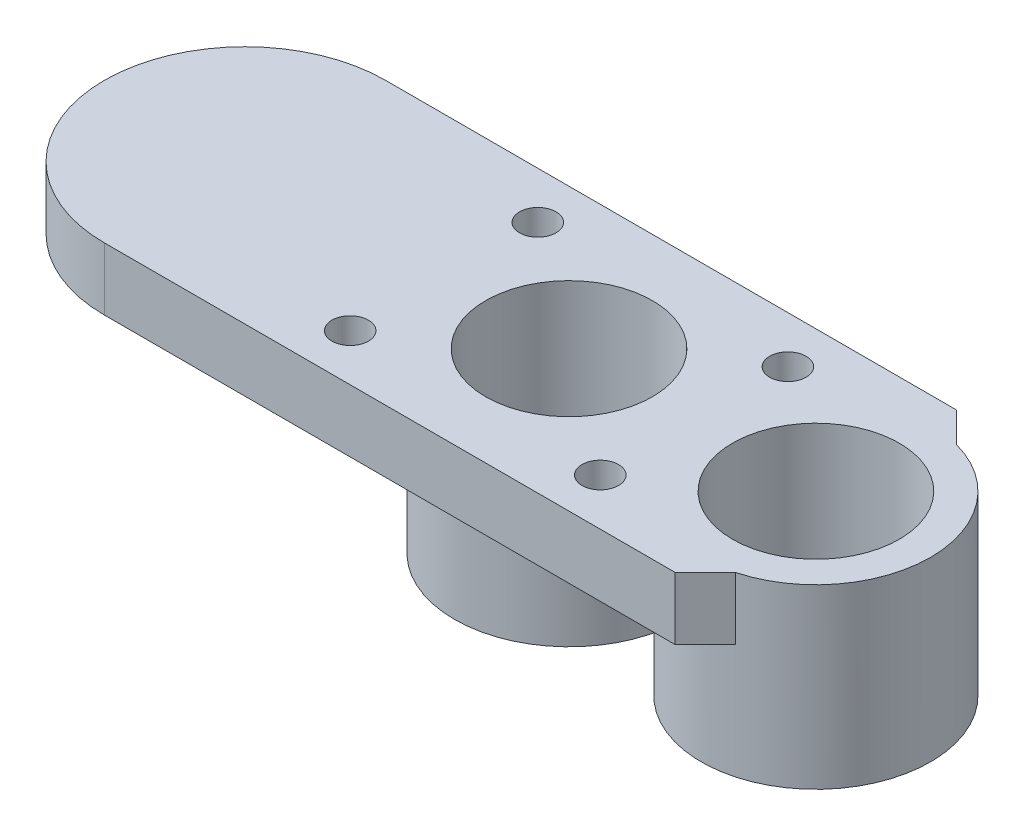
ISO-10303-21;
HEADER;
FILE_DESCRIPTION(('STEP AP214'),'2;1');
FILE_NAME('part.step','',(''),(''),'','','');
FILE_SCHEMA(('AUTOMOTIVE_DESIGN { 1 0 10303 214 1 1 1 1 }'));
ENDSEC;
DATA;
#1=APPLICATION_CONTEXT('core data for automotive mechanical design processes');
#2=APPLICATION_PROTOCOL_DEFINITION('international standard','automotive_design',2000,#1);
#3=PRODUCT_CONTEXT('',#1,'mechanical');
#4=PRODUCT('Part','Part','',(#3));
#5=PRODUCT_RELATED_PRODUCT_CATEGORY('part','',(#4));
#6=PRODUCT_DEFINITION_FORMATION('','',#4);
#7=PRODUCT_DEFINITION_CONTEXT('part definition',#1,'design');
#8=PRODUCT_DEFINITION('design','',#6,#7);
#9=PRODUCT_DEFINITION_SHAPE('','',#8);
#10=(LENGTH_UNIT() NAMED_UNIT(*) SI_UNIT(.MILLI.,.METRE.));
#11=(NAMED_UNIT(*) PLANE_ANGLE_UNIT() SI_UNIT($,.RADIAN.));
#12=(NAMED_UNIT(*) SI_UNIT($,.STERADIAN.) SOLID_ANGLE_UNIT());
#13=UNCERTAINTY_MEASURE_WITH_UNIT(LENGTH_MEASURE(1.E-05),#10,'distance_accuracy_value','');
#14=(GEOMETRIC_REPRESENTATION_CONTEXT(3) GLOBAL_UNCERTAINTY_ASSIGNED_CONTEXT((#13)) GLOBAL_UNIT_ASSIGNED_CONTEXT((#10,
#11,#12)) REPRESENTATION_CONTEXT('',''));
#15=CARTESIAN_POINT('',(0.,0.,0.));
#16=DIRECTION('',(0.,0.,1.));
#17=DIRECTION('',(1.,0.,0.));
#18=AXIS2_PLACEMENT_3D('',#15,#16,#17);
#19=CARTESIAN_POINT('',(12.,6.,-9.));
#20=DIRECTION('',(0.,-1.,0.));
#21=DIRECTION('',(0.,0.,-1.));
#22=AXIS2_PLACEMENT_3D('',#19,#20,#21);
#23=CYLINDRICAL_SURFACE('',#22,1.75);
#24=CARTESIAN_POINT('',(12.,6.,-9.));
#25=DIRECTION('',(0.,1.,0.));
#26=DIRECTION('',(0.,0.,1.));
#27=AXIS2_PLACEMENT_3D('',#24,#25,#26);
#28=CIRCLE('',#27,1.75);
#29=CARTESIAN_POINT('',(12.,6.,-7.25));
#30=VERTEX_POINT('',#29);
#31=EDGE_CURVE('E105',#30,#30,#28,.T.);
#32=ORIENTED_EDGE('',*,*,#31,.T.);
#33=EDGE_LOOP('',(#32));
#34=FACE_BOUND('',#33,.T.);
#35=CARTESIAN_POINT('',(12.,3.,-9.));
#36=DIRECTION('',(0.,-1.,0.));
#37=DIRECTION('',(0.,0.,-1.));
#38=AXIS2_PLACEMENT_3D('',#35,#36,#37);
#39=CIRCLE('',#38,1.75);
#40=CARTESIAN_POINT('',(12.,3.,-10.75));
#41=VERTEX_POINT('',#40);
#42=EDGE_CURVE('E138',#41,#41,#39,.T.);
#43=ORIENTED_EDGE('',*,*,#42,.T.);
#44=EDGE_LOOP('',(#43));
#45=FACE_BOUND('',#44,.T.);
#46=ADVANCED_FACE('F41',(#34,#45),#23,.F.);
#47=CARTESIAN_POINT('',(12.,6.,9.));
#48=DIRECTION('',(0.,-1.,0.));
#49=DIRECTION('',(0.,0.,-1.));
#50=AXIS2_PLACEMENT_3D('',#47,#48,#49);
#51=CYLINDRICAL_SURFACE('',#50,1.75);
#52=CARTESIAN_POINT('',(12.,6.,9.));
#53=DIRECTION('',(0.,1.,0.));
#54=DIRECTION('',(0.,0.,1.));
#55=AXIS2_PLACEMENT_3D('',#52,#53,#54);
#56=CIRCLE('',#55,1.75);
#57=CARTESIAN_POINT('',(12.,6.,10.75));
#58=VERTEX_POINT('',#57);
#59=EDGE_CURVE('E197',#58,#58,#56,.T.);
#60=ORIENTED_EDGE('',*,*,#59,.T.);
#61=EDGE_LOOP('',(#60));
#62=FACE_BOUND('',#61,.T.);
#63=CARTESIAN_POINT('',(12.,3.,9.));
#64=DIRECTION('',(0.,-1.,0.));
#65=DIRECTION('',(0.,0.,-1.));
#66=AXIS2_PLACEMENT_3D('',#63,#64,#65);
#67=CIRCLE('',#66,1.75);
#68=CARTESIAN_POINT('',(12.,3.,7.25));
#69=VERTEX_POINT('',#68);
#70=EDGE_CURVE('E154',#69,#69,#67,.T.);
#71=ORIENTED_EDGE('',*,*,#70,.T.);
#72=EDGE_LOOP('',(#71));
#73=FACE_BOUND('',#72,.T.);
#74=ADVANCED_FACE('F257',(#62,#73),#51,.F.);
#75=CARTESIAN_POINT('',(-12.,6.,9.));
#76=DIRECTION('',(0.,-1.,0.));
#77=DIRECTION('',(0.,0.,-1.));
#78=AXIS2_PLACEMENT_3D('',#75,#76,#77);
#79=CYLINDRICAL_SURFACE('',#78,1.75);
#80=CARTESIAN_POINT('',(-12.,6.,9.));
#81=DIRECTION('',(0.,1.,0.));
#82=DIRECTION('',(0.,0.,1.));
#83=AXIS2_PLACEMENT_3D('',#80,#81,#82);
#84=CIRCLE('',#83,1.75);
#85=CARTESIAN_POINT('',(-12.,6.,10.75));
#86=VERTEX_POINT('',#85);
#87=EDGE_CURVE('E192',#86,#86,#84,.T.);
#88=ORIENTED_EDGE('',*,*,#87,.T.);
#89=EDGE_LOOP('',(#88));
#90=FACE_BOUND('',#89,.T.);
#91=CARTESIAN_POINT('',(-12.,3.,9.));
#92=DIRECTION('',(0.,-1.,0.));
#93=DIRECTION('',(0.,0.,-1.));
#94=AXIS2_PLACEMENT_3D('',#91,#92,#93);
#95=CIRCLE('',#94,1.75);
#96=CARTESIAN_POINT('',(-12.,3.,7.25));
#97=VERTEX_POINT('',#96);
#98=EDGE_CURVE('E140',#97,#97,#95,.T.);
#99=ORIENTED_EDGE('',*,*,#98,.T.);
#100=EDGE_LOOP('',(#99));
#101=FACE_BOUND('',#100,.T.);
#102=ADVANCED_FACE('F263',(#90,#101),#79,.F.);
#103=CARTESIAN_POINT('',(-12.,6.,-9.));
#104=DIRECTION('',(0.,-1.,0.));
#105=DIRECTION('',(0.,0.,-1.));
#106=AXIS2_PLACEMENT_3D('',#103,#104,#105);
#107=CYLINDRICAL_SURFACE('',#106,1.75);
#108=CARTESIAN_POINT('',(-12.,6.,-9.));
#109=DIRECTION('',(0.,1.,0.));
#110=DIRECTION('',(0.,0.,1.));
#111=AXIS2_PLACEMENT_3D('',#108,#109,#110);
#112=CIRCLE('',#111,1.75);
#113=CARTESIAN_POINT('',(-12.,6.,-7.25));
#114=VERTEX_POINT('',#113);
#115=EDGE_CURVE('E188',#114,#114,#112,.T.);
#116=ORIENTED_EDGE('',*,*,#115,.T.);
#117=EDGE_LOOP('',(#116));
#118=FACE_BOUND('',#117,.T.);
#119=CARTESIAN_POINT('',(-12.,3.,-9.));
#120=DIRECTION('',(0.,-1.,0.));
#121=DIRECTION('',(0.,0.,-1.));
#122=AXIS2_PLACEMENT_3D('',#119,#120,#121);
#123=CIRCLE('',#122,1.75);
#124=CARTESIAN_POINT('',(-12.,3.,-10.75));
#125=VERTEX_POINT('',#124);
#126=EDGE_CURVE('E150',#125,#125,#123,.T.);
#127=ORIENTED_EDGE('',*,*,#126,.T.);
#128=EDGE_LOOP('',(#127));
#129=FACE_BOUND('',#128,.T.);
#130=ADVANCED_FACE('F271',(#118,#129),#107,.F.);
#131=CARTESIAN_POINT('',(0.,6.,13.5));
#132=DIRECTION('',(0.,0.,-1.));
#133=DIRECTION('',(-1.,0.,0.));
#134=AXIS2_PLACEMENT_3D('',#131,#132,#133);
#135=PLANE('',#134);
#136=DIRECTION('',(1.,0.,0.));
#137=VECTOR('',#136,1.);
#138=CARTESIAN_POINT('',(0.,0.,13.5));
#139=LINE('',#138,#137);
#140=CARTESIAN_POINT('',(-31.1,0.,13.5));
#141=VERTEX_POINT('',#140);
#142=CARTESIAN_POINT('',(23.69,0.,13.5));
#143=VERTEX_POINT('',#142);
#144=EDGE_CURVE('E184',#141,#143,#139,.T.);
#145=ORIENTED_EDGE('',*,*,#144,.T.);
#146=DIRECTION('',(0.,-1.,0.));
#147=VECTOR('',#146,1.);
#148=CARTESIAN_POINT('',(23.69,6.,13.5));
#149=LINE('',#148,#147);
#150=CARTESIAN_POINT('',(23.69,6.,13.5));
#151=VERTEX_POINT('',#150);
#152=EDGE_CURVE('E99',#151,#143,#149,.T.);
#153=ORIENTED_EDGE('',*,*,#152,.F.);
#154=DIRECTION('',(1.,0.,0.));
#155=VECTOR('',#154,1.);
#156=CARTESIAN_POINT('',(0.,6.,13.5));
#157=LINE('',#156,#155);
#158=CARTESIAN_POINT('',(-31.1,6.,13.5));
#159=VERTEX_POINT('',#158);
#160=EDGE_CURVE('E92',#159,#151,#157,.T.);
#161=ORIENTED_EDGE('',*,*,#160,.F.);
#162=DIRECTION('',(0.,-1.,0.));
#163=VECTOR('',#162,1.);
#164=CARTESIAN_POINT('',(-31.1,6.,13.5));
#165=LINE('',#164,#163);
#166=EDGE_CURVE('E96',#159,#141,#165,.T.);
#167=ORIENTED_EDGE('',*,*,#166,.T.);
#168=EDGE_LOOP('',(#145,#153,#161,#167));
#169=FACE_BOUND('',#168,.T.);
#170=ADVANCED_FACE('F95',(#169),#135,.F.);
#171=CARTESIAN_POINT('',(23.69,6.,0.));
#172=DIRECTION('',(0.,-1.,0.));
#173=DIRECTION('',(0.,0.,-1.));
#174=AXIS2_PLACEMENT_3D('',#171,#172,#173);
#175=CYLINDRICAL_SURFACE('',#174,11.);
#176=CARTESIAN_POINT('',(23.69,6.,0.));
#177=DIRECTION('',(0.,1.,0.));
#178=DIRECTION('',(0.,0.,1.));
#179=AXIS2_PLACEMENT_3D('',#176,#177,#178);
#180=CIRCLE('',#179,11.);
#181=CARTESIAN_POINT('',(26.575093791565,6.,10.6149062084351));
#182=VERTEX_POINT('',#181);
#183=CARTESIAN_POINT('',(26.5750937915649,6.,-10.6149062084351));
#184=VERTEX_POINT('',#183);
#185=EDGE_CURVE('E104',#182,#184,#180,.T.);
#186=ORIENTED_EDGE('',*,*,#185,.F.);
#187=DIRECTION('',(0.,-1.,0.));
#188=VECTOR('',#187,1.);
#189=CARTESIAN_POINT('',(26.575093791565,6.,10.6149062084351));
#190=LINE('',#189,#188);
#191=CARTESIAN_POINT('',(26.575093791565,0.,10.6149062084351));
#192=VERTEX_POINT('',#191);
#193=EDGE_CURVE('E225',#182,#192,#190,.T.);
#194=ORIENTED_EDGE('',*,*,#193,.T.);
#195=CARTESIAN_POINT('',(23.69,0.,0.));
#196=DIRECTION('',(0.,1.,0.));
#197=DIRECTION('',(0.,0.,1.));
#198=AXIS2_PLACEMENT_3D('',#195,#196,#197);
#199=CIRCLE('',#198,11.);
#200=CARTESIAN_POINT('',(26.5750937915649,0.,-10.6149062084351));
#201=VERTEX_POINT('',#200);
#202=EDGE_CURVE('E57',#201,#192,#199,.T.);
#203=ORIENTED_EDGE('',*,*,#202,.F.);
#204=DIRECTION('',(0.,-1.,0.));
#205=VECTOR('',#204,1.);
#206=CARTESIAN_POINT('',(26.5750937915649,6.,-10.6149062084351));
#207=LINE('',#206,#205);
#208=EDGE_CURVE('E115',#201,#184,#207,.F.);
#209=ORIENTED_EDGE('',*,*,#208,.T.);
#210=EDGE_LOOP('',(#186,#194,#203,#209));
#211=FACE_BOUND('',#210,.T.);
#212=CARTESIAN_POINT('',(23.69,-11.,0.));
#213=DIRECTION('',(0.,-1.,0.));
#214=DIRECTION('',(0.,0.,-1.));
#215=AXIS2_PLACEMENT_3D('',#212,#213,#214);
#216=CIRCLE('',#215,11.);
#217=CARTESIAN_POINT('',(23.69,-11.,-11.));
#218=VERTEX_POINT('',#217);
#219=EDGE_CURVE('E608',#218,#218,#216,.T.);
#220=ORIENTED_EDGE('',*,*,#219,.F.);
#221=EDGE_LOOP('',(#220));
#222=FACE_BOUND('',#221,.T.);
#223=ADVANCED_FACE('F241',(#211,#222),#175,.T.);
#224=CARTESIAN_POINT('',(0.,6.,-13.5));
#225=DIRECTION('',(0.,0.,-1.));
#226=DIRECTION('',(-1.,0.,0.));
#227=AXIS2_PLACEMENT_3D('',#224,#225,#226);
#228=PLANE('',#227);
#229=DIRECTION('',(1.,0.,0.));
#230=VECTOR('',#229,1.);
#231=CARTESIAN_POINT('',(0.,0.,-13.5));
#232=LINE('',#231,#230);
#233=CARTESIAN_POINT('',(-31.1,0.,-13.5));
#234=VERTEX_POINT('',#233);
#235=CARTESIAN_POINT('',(23.69,0.,-13.5));
#236=VERTEX_POINT('',#235);
#237=EDGE_CURVE('E193',#234,#236,#232,.T.);
#238=ORIENTED_EDGE('',*,*,#237,.F.);
#239=DIRECTION('',(0.,-1.,0.));
#240=VECTOR('',#239,1.);
#241=CARTESIAN_POINT('',(-31.1,6.,-13.5));
#242=LINE('',#241,#240);
#243=CARTESIAN_POINT('',(-31.1,6.,-13.5));
#244=VERTEX_POINT('',#243);
#245=EDGE_CURVE('E209',#244,#234,#242,.T.);
#246=ORIENTED_EDGE('',*,*,#245,.F.);
#247=DIRECTION('',(1.,0.,0.));
#248=VECTOR('',#247,1.);
#249=CARTESIAN_POINT('',(0.,6.,-13.5));
#250=LINE('',#249,#248);
#251=CARTESIAN_POINT('',(23.69,6.,-13.5));
#252=VERTEX_POINT('',#251);
#253=EDGE_CURVE('E121',#244,#252,#250,.T.);
#254=ORIENTED_EDGE('',*,*,#253,.T.);
#255=DIRECTION('',(0.,-1.,0.));
#256=VECTOR('',#255,1.);
#257=CARTESIAN_POINT('',(23.69,6.,-13.5));
#258=LINE('',#257,#256);
#259=EDGE_CURVE('E217',#252,#236,#258,.T.);
#260=ORIENTED_EDGE('',*,*,#259,.T.);
#261=EDGE_LOOP('',(#238,#246,#254,#260));
#262=FACE_BOUND('',#261,.T.);
#263=ADVANCED_FACE('F303',(#262),#228,.T.);
#264=CARTESIAN_POINT('',(0.,6.,0.));
#265=DIRECTION('',(0.,1.,0.));
#266=DIRECTION('',(0.,0.,1.));
#267=AXIS2_PLACEMENT_3D('',#264,#265,#266);
#268=PLANE('',#267);
#269=CARTESIAN_POINT('',(-31.1,6.,0.));
#270=DIRECTION('',(0.,1.,0.));
#271=DIRECTION('',(0.,0.,1.));
#272=AXIS2_PLACEMENT_3D('',#269,#270,#271);
#273=CIRCLE('',#272,13.5);
#274=EDGE_CURVE('E111',#244,#159,#273,.T.);
#275=ORIENTED_EDGE('',*,*,#274,.T.);
#276=ORIENTED_EDGE('',*,*,#160,.T.);
#277=DIRECTION('',(0.707106781186551,0.,-0.707106781186544));
#278=VECTOR('',#277,1.);
#279=CARTESIAN_POINT('',(26.575093791565,6.,10.6149062084351));
#280=LINE('',#279,#278);
#281=EDGE_CURVE('E231',#151,#182,#280,.T.);
#282=ORIENTED_EDGE('',*,*,#281,.T.);
#283=ORIENTED_EDGE('',*,*,#185,.T.);
#284=DIRECTION('',(-0.707106781186542,0.,-0.707106781186553));
#285=VECTOR('',#284,1.);
#286=CARTESIAN_POINT('',(23.69,6.,-13.5));
#287=LINE('',#286,#285);
#288=EDGE_CURVE('E11',#184,#252,#287,.T.);
#289=ORIENTED_EDGE('',*,*,#288,.T.);
#290=ORIENTED_EDGE('',*,*,#253,.F.);
#291=EDGE_LOOP('',(#275,#276,#282,#283,#289,#290));
#292=FACE_BOUND('',#291,.T.);
#293=CARTESIAN_POINT('',(0.,6.,0.));
#294=DIRECTION('',(0.,1.,0.));
#295=DIRECTION('',(0.,0.,1.));
#296=AXIS2_PLACEMENT_3D('',#293,#294,#295);
#297=CIRCLE('',#296,8.);
#298=CARTESIAN_POINT('',(0.,6.,8.));
#299=VERTEX_POINT('',#298);
#300=EDGE_CURVE('E128',#299,#299,#297,.T.);
#301=ORIENTED_EDGE('',*,*,#300,.F.);
#302=EDGE_LOOP('',(#301));
#303=FACE_BOUND('',#302,.T.);
#304=CARTESIAN_POINT('',(23.69,6.,0.));
#305=DIRECTION('',(0.,1.,0.));
#306=DIRECTION('',(0.,0.,1.));
#307=AXIS2_PLACEMENT_3D('',#304,#305,#306);
#308=CIRCLE('',#307,8.);
#309=CARTESIAN_POINT('',(23.69,6.,8.));
#310=VERTEX_POINT('',#309);
#311=EDGE_CURVE('E123',#310,#310,#308,.T.);
#312=ORIENTED_EDGE('',*,*,#311,.F.);
#313=EDGE_LOOP('',(#312));
#314=FACE_BOUND('',#313,.T.);
#315=ORIENTED_EDGE('',*,*,#115,.F.);
#316=EDGE_LOOP('',(#315));
#317=FACE_BOUND('',#316,.T.);
#318=ORIENTED_EDGE('',*,*,#87,.F.);
#319=EDGE_LOOP('',(#318));
#320=FACE_BOUND('',#319,.T.);
#321=ORIENTED_EDGE('',*,*,#59,.F.);
#322=EDGE_LOOP('',(#321));
#323=FACE_BOUND('',#322,.T.);
#324=ORIENTED_EDGE('',*,*,#31,.F.);
#325=EDGE_LOOP('',(#324));
#326=FACE_BOUND('',#325,.T.);
#327=ADVANCED_FACE('F118',(#292,#303,#314,#317,#320,#323,#326),#268,.T.);
#328=CARTESIAN_POINT('',(0.,0.,0.));
#329=DIRECTION('',(0.,1.,0.));
#330=DIRECTION('',(0.,0.,1.));
#331=AXIS2_PLACEMENT_3D('',#328,#329,#330);
#332=PLANE('',#331);
#333=CARTESIAN_POINT('',(0.,0.,0.));
#334=DIRECTION('',(0.,1.,0.));
#335=DIRECTION('',(0.,0.,1.));
#336=AXIS2_PLACEMENT_3D('',#333,#334,#335);
#337=CIRCLE('',#336,11.);
#338=CARTESIAN_POINT('',(0.,0.,11.));
#339=VERTEX_POINT('',#338);
#340=EDGE_CURVE('E133',#339,#339,#337,.T.);
#341=ORIENTED_EDGE('',*,*,#340,.T.);
#342=EDGE_LOOP('',(#341));
#343=FACE_BOUND('',#342,.T.);
#344=ORIENTED_EDGE('',*,*,#237,.T.);
#345=DIRECTION('',(0.707106781186542,0.,0.707106781186553));
#346=VECTOR('',#345,1.);
#347=CARTESIAN_POINT('',(18.5950000000002,0.,-18.5949999999999));
#348=LINE('',#347,#346);
#349=EDGE_CURVE('E50',#236,#201,#348,.T.);
#350=ORIENTED_EDGE('',*,*,#349,.T.);
#351=ORIENTED_EDGE('',*,*,#202,.T.);
#352=DIRECTION('',(-0.707106781186551,0.,0.707106781186544));
#353=VECTOR('',#352,1.);
#354=CARTESIAN_POINT('',(18.5949999999999,0.,18.5950000000001));
#355=LINE('',#354,#353);
#356=EDGE_CURVE('E228',#192,#143,#355,.T.);
#357=ORIENTED_EDGE('',*,*,#356,.T.);
#358=ORIENTED_EDGE('',*,*,#144,.F.);
#359=CARTESIAN_POINT('',(-31.1,0.,0.));
#360=DIRECTION('',(0.,1.,0.));
#361=DIRECTION('',(0.,0.,1.));
#362=AXIS2_PLACEMENT_3D('',#359,#360,#361);
#363=CIRCLE('',#362,13.5);
#364=EDGE_CURVE('E113',#234,#141,#363,.T.);
#365=ORIENTED_EDGE('',*,*,#364,.F.);
#366=EDGE_LOOP('',(#344,#350,#351,#357,#358,#365));
#367=FACE_BOUND('',#366,.T.);
#368=CARTESIAN_POINT('',(12.,0.,-9.));
#369=DIRECTION('',(0.,-1.,0.));
#370=DIRECTION('',(0.,0.,-1.));
#371=AXIS2_PLACEMENT_3D('',#368,#369,#370);
#372=CIRCLE('',#371,3.);
#373=CARTESIAN_POINT('',(12.,0.,-12.));
#374=VERTEX_POINT('',#373);
#375=EDGE_CURVE('E169',#374,#374,#372,.T.);
#376=ORIENTED_EDGE('',*,*,#375,.F.);
#377=EDGE_LOOP('',(#376));
#378=FACE_BOUND('',#377,.T.);
#379=CARTESIAN_POINT('',(12.,0.,9.));
#380=DIRECTION('',(0.,-1.,0.));
#381=DIRECTION('',(0.,0.,-1.));
#382=AXIS2_PLACEMENT_3D('',#379,#380,#381);
#383=CIRCLE('',#382,3.);
#384=CARTESIAN_POINT('',(12.,0.,6.));
#385=VERTEX_POINT('',#384);
#386=EDGE_CURVE('E158',#385,#385,#383,.T.);
#387=ORIENTED_EDGE('',*,*,#386,.F.);
#388=EDGE_LOOP('',(#387));
#389=FACE_BOUND('',#388,.T.);
#390=CARTESIAN_POINT('',(-12.,0.,9.));
#391=DIRECTION('',(0.,-1.,0.));
#392=DIRECTION('',(0.,0.,-1.));
#393=AXIS2_PLACEMENT_3D('',#390,#391,#392);
#394=CIRCLE('',#393,3.);
#395=CARTESIAN_POINT('',(-12.,0.,6.));
#396=VERTEX_POINT('',#395);
#397=EDGE_CURVE('E144',#396,#396,#394,.T.);
#398=ORIENTED_EDGE('',*,*,#397,.F.);
#399=EDGE_LOOP('',(#398));
#400=FACE_BOUND('',#399,.T.);
#401=CARTESIAN_POINT('',(-12.,0.,-9.));
#402=DIRECTION('',(0.,-1.,0.));
#403=DIRECTION('',(0.,0.,-1.));
#404=AXIS2_PLACEMENT_3D('',#401,#402,#403);
#405=CIRCLE('',#404,3.);
#406=CARTESIAN_POINT('',(-12.,0.,-12.));
#407=VERTEX_POINT('',#406);
#408=EDGE_CURVE('E179',#407,#407,#405,.T.);
#409=ORIENTED_EDGE('',*,*,#408,.F.);
#410=EDGE_LOOP('',(#409));
#411=FACE_BOUND('',#410,.T.);
#412=ADVANCED_FACE('F235',(#343,#367,#378,#389,#400,#411),#332,.F.);
#413=CARTESIAN_POINT('',(-12.,3.,-9.));
#414=DIRECTION('',(0.,-1.,0.));
#415=DIRECTION('',(0.,0.,-1.));
#416=AXIS2_PLACEMENT_3D('',#413,#414,#415);
#417=CYLINDRICAL_SURFACE('',#416,3.);
#418=CARTESIAN_POINT('',(-12.,3.,-9.));
#419=DIRECTION('',(0.,-1.,0.));
#420=DIRECTION('',(0.,0.,-1.));
#421=AXIS2_PLACEMENT_3D('',#418,#419,#420);
#422=CIRCLE('',#421,3.);
#423=CARTESIAN_POINT('',(-12.,3.,-12.));
#424=VERTEX_POINT('',#423);
#425=EDGE_CURVE('E180',#424,#424,#422,.T.);
#426=ORIENTED_EDGE('',*,*,#425,.F.);
#427=EDGE_LOOP('',(#426));
#428=FACE_BOUND('',#427,.T.);
#429=ORIENTED_EDGE('',*,*,#408,.T.);
#430=EDGE_LOOP('',(#429));
#431=FACE_BOUND('',#430,.T.);
#432=ADVANCED_FACE('F287',(#428,#431),#417,.F.);
#433=CARTESIAN_POINT('',(-12.,3.,-9.));
#434=DIRECTION('',(0.,-1.,0.));
#435=DIRECTION('',(0.,0.,-1.));
#436=AXIS2_PLACEMENT_3D('',#433,#434,#435);
#437=PLANE('',#436);
#438=ORIENTED_EDGE('',*,*,#126,.F.);
#439=EDGE_LOOP('',(#438));
#440=FACE_BOUND('',#439,.T.);
#441=ORIENTED_EDGE('',*,*,#425,.T.);
#442=EDGE_LOOP('',(#441));
#443=FACE_BOUND('',#442,.T.);
#444=ADVANCED_FACE('F283',(#440,#443),#437,.T.);
#445=CARTESIAN_POINT('',(-12.,3.,9.));
#446=DIRECTION('',(0.,-1.,0.));
#447=DIRECTION('',(0.,0.,-1.));
#448=AXIS2_PLACEMENT_3D('',#445,#446,#447);
#449=CYLINDRICAL_SURFACE('',#448,3.);
#450=CARTESIAN_POINT('',(-12.,3.,9.));
#451=DIRECTION('',(0.,-1.,0.));
#452=DIRECTION('',(0.,0.,-1.));
#453=AXIS2_PLACEMENT_3D('',#450,#451,#452);
#454=CIRCLE('',#453,3.);
#455=CARTESIAN_POINT('',(-12.,3.,6.));
#456=VERTEX_POINT('',#455);
#457=EDGE_CURVE('E146',#456,#456,#454,.T.);
#458=ORIENTED_EDGE('',*,*,#457,.F.);
#459=EDGE_LOOP('',(#458));
#460=FACE_BOUND('',#459,.T.);
#461=ORIENTED_EDGE('',*,*,#397,.T.);
#462=EDGE_LOOP('',(#461));
#463=FACE_BOUND('',#462,.T.);
#464=ADVANCED_FACE('F286',(#460,#463),#449,.F.);
#465=CARTESIAN_POINT('',(-12.,3.,9.));
#466=DIRECTION('',(0.,-1.,0.));
#467=DIRECTION('',(0.,0.,-1.));
#468=AXIS2_PLACEMENT_3D('',#465,#466,#467);
#469=PLANE('',#468);
#470=ORIENTED_EDGE('',*,*,#98,.F.);
#471=EDGE_LOOP('',(#470));
#472=FACE_BOUND('',#471,.T.);
#473=ORIENTED_EDGE('',*,*,#457,.T.);
#474=EDGE_LOOP('',(#473));
#475=FACE_BOUND('',#474,.T.);
#476=ADVANCED_FACE('F488',(#472,#475),#469,.T.);
#477=CARTESIAN_POINT('',(12.,3.,9.));
#478=DIRECTION('',(0.,-1.,0.));
#479=DIRECTION('',(0.,0.,-1.));
#480=AXIS2_PLACEMENT_3D('',#477,#478,#479);
#481=CYLINDRICAL_SURFACE('',#480,3.);
#482=CARTESIAN_POINT('',(12.,3.,9.));
#483=DIRECTION('',(0.,-1.,0.));
#484=DIRECTION('',(0.,0.,-1.));
#485=AXIS2_PLACEMENT_3D('',#482,#483,#484);
#486=CIRCLE('',#485,3.);
#487=CARTESIAN_POINT('',(12.,3.,6.));
#488=VERTEX_POINT('',#487);
#489=EDGE_CURVE('E145',#488,#488,#486,.T.);
#490=ORIENTED_EDGE('',*,*,#489,.F.);
#491=EDGE_LOOP('',(#490));
#492=FACE_BOUND('',#491,.T.);
#493=ORIENTED_EDGE('',*,*,#386,.T.);
#494=EDGE_LOOP('',(#493));
#495=FACE_BOUND('',#494,.T.);
#496=ADVANCED_FACE('F478',(#492,#495),#481,.F.);
#497=CARTESIAN_POINT('',(12.,3.,9.));
#498=DIRECTION('',(0.,-1.,0.));
#499=DIRECTION('',(0.,0.,-1.));
#500=AXIS2_PLACEMENT_3D('',#497,#498,#499);
#501=PLANE('',#500);
#502=ORIENTED_EDGE('',*,*,#70,.F.);
#503=EDGE_LOOP('',(#502));
#504=FACE_BOUND('',#503,.T.);
#505=ORIENTED_EDGE('',*,*,#489,.T.);
#506=EDGE_LOOP('',(#505));
#507=FACE_BOUND('',#506,.T.);
#508=ADVANCED_FACE('F468',(#504,#507),#501,.T.);
#509=CARTESIAN_POINT('',(12.,3.,-9.));
#510=DIRECTION('',(0.,-1.,0.));
#511=DIRECTION('',(0.,0.,-1.));
#512=AXIS2_PLACEMENT_3D('',#509,#510,#511);
#513=CYLINDRICAL_SURFACE('',#512,3.);
#514=CARTESIAN_POINT('',(12.,3.,-9.));
#515=DIRECTION('',(0.,-1.,0.));
#516=DIRECTION('',(0.,0.,-1.));
#517=AXIS2_PLACEMENT_3D('',#514,#515,#516);
#518=CIRCLE('',#517,3.);
#519=CARTESIAN_POINT('',(12.,3.,-12.));
#520=VERTEX_POINT('',#519);
#521=EDGE_CURVE('E159',#520,#520,#518,.T.);
#522=ORIENTED_EDGE('',*,*,#521,.F.);
#523=EDGE_LOOP('',(#522));
#524=FACE_BOUND('',#523,.T.);
#525=ORIENTED_EDGE('',*,*,#375,.T.);
#526=EDGE_LOOP('',(#525));
#527=FACE_BOUND('',#526,.T.);
#528=ADVANCED_FACE('F459',(#524,#527),#513,.F.);
#529=CARTESIAN_POINT('',(12.,3.,-9.));
#530=DIRECTION('',(0.,-1.,0.));
#531=DIRECTION('',(0.,0.,-1.));
#532=AXIS2_PLACEMENT_3D('',#529,#530,#531);
#533=PLANE('',#532);
#534=ORIENTED_EDGE('',*,*,#42,.F.);
#535=EDGE_LOOP('',(#534));
#536=FACE_BOUND('',#535,.T.);
#537=ORIENTED_EDGE('',*,*,#521,.T.);
#538=EDGE_LOOP('',(#537));
#539=FACE_BOUND('',#538,.T.);
#540=ADVANCED_FACE('F315',(#536,#539),#533,.T.);
#541=CARTESIAN_POINT('',(23.69,3.,0.));
#542=DIRECTION('',(0.,1.,0.));
#543=DIRECTION('',(0.,0.,1.));
#544=AXIS2_PLACEMENT_3D('',#541,#542,#543);
#545=CYLINDRICAL_SURFACE('',#544,8.);
#546=ORIENTED_EDGE('',*,*,#311,.T.);
#547=EDGE_LOOP('',(#546));
#548=FACE_BOUND('',#547,.T.);
#549=CARTESIAN_POINT('',(23.69,-8.,0.));
#550=DIRECTION('',(0.,1.,0.));
#551=DIRECTION('',(0.,0.,1.));
#552=AXIS2_PLACEMENT_3D('',#549,#550,#551);
#553=CIRCLE('',#552,8.);
#554=CARTESIAN_POINT('',(23.69,-8.,8.));
#555=VERTEX_POINT('',#554);
#556=EDGE_CURVE('E604',#555,#555,#553,.T.);
#557=ORIENTED_EDGE('',*,*,#556,.F.);
#558=EDGE_LOOP('',(#557));
#559=FACE_BOUND('',#558,.T.);
#560=ADVANCED_FACE('F419',(#548,#559),#545,.F.);
#561=CARTESIAN_POINT('',(0.,3.,0.));
#562=DIRECTION('',(0.,1.,0.));
#563=DIRECTION('',(0.,0.,1.));
#564=AXIS2_PLACEMENT_3D('',#561,#562,#563);
#565=CYLINDRICAL_SURFACE('',#564,8.);
#566=ORIENTED_EDGE('',*,*,#300,.T.);
#567=EDGE_LOOP('',(#566));
#568=FACE_BOUND('',#567,.T.);
#569=CARTESIAN_POINT('',(0.,-8.,0.));
#570=DIRECTION('',(0.,1.,0.));
#571=DIRECTION('',(0.,0.,1.));
#572=AXIS2_PLACEMENT_3D('',#569,#570,#571);
#573=CIRCLE('',#572,8.);
#574=CARTESIAN_POINT('',(0.,-8.,8.));
#575=VERTEX_POINT('',#574);
#576=EDGE_CURVE('E130',#575,#575,#573,.T.);
#577=ORIENTED_EDGE('',*,*,#576,.F.);
#578=EDGE_LOOP('',(#577));
#579=FACE_BOUND('',#578,.T.);
#580=ADVANCED_FACE('F424',(#568,#579),#565,.F.);
#581=CARTESIAN_POINT('',(-31.1,6.,0.));
#582=DIRECTION('',(0.,-1.,0.));
#583=DIRECTION('',(0.,0.,-1.));
#584=AXIS2_PLACEMENT_3D('',#581,#582,#583);
#585=CYLINDRICAL_SURFACE('',#584,13.5);
#586=ORIENTED_EDGE('',*,*,#364,.T.);
#587=ORIENTED_EDGE('',*,*,#166,.F.);
#588=ORIENTED_EDGE('',*,*,#274,.F.);
#589=ORIENTED_EDGE('',*,*,#245,.T.);
#590=EDGE_LOOP('',(#586,#587,#588,#589));
#591=FACE_BOUND('',#590,.T.);
#592=ADVANCED_FACE('F109',(#591),#585,.T.);
#593=CARTESIAN_POINT('',(0.,-8.,0.));
#594=DIRECTION('',(0.,1.,0.));
#595=DIRECTION('',(0.,0.,1.));
#596=AXIS2_PLACEMENT_3D('',#593,#594,#595);
#597=CYLINDRICAL_SURFACE('',#596,11.);
#598=ORIENTED_EDGE('',*,*,#340,.F.);
#599=EDGE_LOOP('',(#598));
#600=FACE_BOUND('',#599,.T.);
#601=CARTESIAN_POINT('',(0.,-11.,0.));
#602=DIRECTION('',(0.,-1.,0.));
#603=DIRECTION('',(0.,0.,-1.));
#604=AXIS2_PLACEMENT_3D('',#601,#602,#603);
#605=CIRCLE('',#604,11.);
#606=CARTESIAN_POINT('',(0.,-11.,-11.));
#607=VERTEX_POINT('',#606);
#608=EDGE_CURVE('E620',#607,#607,#605,.T.);
#609=ORIENTED_EDGE('',*,*,#608,.F.);
#610=EDGE_LOOP('',(#609));
#611=FACE_BOUND('',#610,.T.);
#612=ADVANCED_FACE('F392',(#600,#611),#597,.T.);
#613=CARTESIAN_POINT('',(23.69,-8.,0.));
#614=DIRECTION('',(0.,-1.,0.));
#615=DIRECTION('',(0.,0.,-1.));
#616=AXIS2_PLACEMENT_3D('',#613,#614,#615);
#617=PLANE('',#616);
#618=CARTESIAN_POINT('',(23.69,-8.,0.));
#619=DIRECTION('',(0.,-1.,0.));
#620=DIRECTION('',(0.,0.,-1.));
#621=AXIS2_PLACEMENT_3D('',#618,#619,#620);
#622=CIRCLE('',#621,5.);
#623=CARTESIAN_POINT('',(23.69,-8.,-5.));
#624=VERTEX_POINT('',#623);
#625=EDGE_CURVE('E616',#624,#624,#622,.T.);
#626=ORIENTED_EDGE('',*,*,#625,.T.);
#627=EDGE_LOOP('',(#626));
#628=FACE_BOUND('',#627,.T.);
#629=ORIENTED_EDGE('',*,*,#556,.T.);
#630=EDGE_LOOP('',(#629));
#631=FACE_BOUND('',#630,.T.);
#632=ADVANCED_FACE('F383',(#628,#631),#617,.F.);
#633=CARTESIAN_POINT('',(23.69,-11.,0.));
#634=DIRECTION('',(0.,-1.,0.));
#635=DIRECTION('',(0.,0.,-1.));
#636=AXIS2_PLACEMENT_3D('',#633,#634,#635);
#637=PLANE('',#636);
#638=ORIENTED_EDGE('',*,*,#219,.T.);
#639=EDGE_LOOP('',(#638));
#640=FACE_BOUND('',#639,.T.);
#641=CARTESIAN_POINT('',(23.69,-11.,0.));
#642=DIRECTION('',(0.,-1.,0.));
#643=DIRECTION('',(0.,0.,-1.));
#644=AXIS2_PLACEMENT_3D('',#641,#642,#643);
#645=CIRCLE('',#644,5.);
#646=CARTESIAN_POINT('',(23.69,-11.,-5.));
#647=VERTEX_POINT('',#646);
#648=EDGE_CURVE('E615',#647,#647,#645,.T.);
#649=ORIENTED_EDGE('',*,*,#648,.F.);
#650=EDGE_LOOP('',(#649));
#651=FACE_BOUND('',#650,.T.);
#652=ADVANCED_FACE('F374',(#640,#651),#637,.T.);
#653=CARTESIAN_POINT('',(23.69,-11.,0.));
#654=DIRECTION('',(0.,1.,0.));
#655=DIRECTION('',(0.,0.,1.));
#656=AXIS2_PLACEMENT_3D('',#653,#654,#655);
#657=CYLINDRICAL_SURFACE('',#656,5.);
#658=ORIENTED_EDGE('',*,*,#648,.T.);
#659=EDGE_LOOP('',(#658));
#660=FACE_BOUND('',#659,.T.);
#661=ORIENTED_EDGE('',*,*,#625,.F.);
#662=EDGE_LOOP('',(#661));
#663=FACE_BOUND('',#662,.T.);
#664=ADVANCED_FACE('F365',(#660,#663),#657,.F.);
#665=CARTESIAN_POINT('',(0.,-8.,0.));
#666=DIRECTION('',(0.,-1.,0.));
#667=DIRECTION('',(0.,0.,-1.));
#668=AXIS2_PLACEMENT_3D('',#665,#666,#667);
#669=PLANE('',#668);
#670=CARTESIAN_POINT('',(0.,-8.,0.));
#671=DIRECTION('',(0.,-1.,0.));
#672=DIRECTION('',(0.,0.,-1.));
#673=AXIS2_PLACEMENT_3D('',#670,#671,#672);
#674=CIRCLE('',#673,5.);
#675=CARTESIAN_POINT('',(0.,-8.,-5.));
#676=VERTEX_POINT('',#675);
#677=EDGE_CURVE('E628',#676,#676,#674,.T.);
#678=ORIENTED_EDGE('',*,*,#677,.T.);
#679=EDGE_LOOP('',(#678));
#680=FACE_BOUND('',#679,.T.);
#681=ORIENTED_EDGE('',*,*,#576,.T.);
#682=EDGE_LOOP('',(#681));
#683=FACE_BOUND('',#682,.T.);
#684=ADVANCED_FACE('F356',(#680,#683),#669,.F.);
#685=CARTESIAN_POINT('',(0.,-11.,0.));
#686=DIRECTION('',(0.,-1.,0.));
#687=DIRECTION('',(0.,0.,-1.));
#688=AXIS2_PLACEMENT_3D('',#685,#686,#687);
#689=PLANE('',#688);
#690=ORIENTED_EDGE('',*,*,#608,.T.);
#691=EDGE_LOOP('',(#690));
#692=FACE_BOUND('',#691,.T.);
#693=CARTESIAN_POINT('',(0.,-11.,0.));
#694=DIRECTION('',(0.,-1.,0.));
#695=DIRECTION('',(0.,0.,-1.));
#696=AXIS2_PLACEMENT_3D('',#693,#694,#695);
#697=CIRCLE('',#696,5.);
#698=CARTESIAN_POINT('',(0.,-11.,-5.));
#699=VERTEX_POINT('',#698);
#700=EDGE_CURVE('E627',#699,#699,#697,.T.);
#701=ORIENTED_EDGE('',*,*,#700,.F.);
#702=EDGE_LOOP('',(#701));
#703=FACE_BOUND('',#702,.T.);
#704=ADVANCED_FACE('F252',(#692,#703),#689,.T.);
#705=CARTESIAN_POINT('',(0.,-11.,0.));
#706=DIRECTION('',(0.,1.,0.));
#707=DIRECTION('',(0.,0.,1.));
#708=AXIS2_PLACEMENT_3D('',#705,#706,#707);
#709=CYLINDRICAL_SURFACE('',#708,5.);
#710=ORIENTED_EDGE('',*,*,#700,.T.);
#711=EDGE_LOOP('',(#710));
#712=FACE_BOUND('',#711,.T.);
#713=ORIENTED_EDGE('',*,*,#677,.F.);
#714=EDGE_LOOP('',(#713));
#715=FACE_BOUND('',#714,.T.);
#716=ADVANCED_FACE('F247',(#712,#715),#709,.F.);
#717=CARTESIAN_POINT('',(26.575093791565,6.,10.6149062084351));
#718=DIRECTION('',(-0.707106781186544,0.,-0.707106781186551));
#719=DIRECTION('',(0.,-1.,0.));
#720=AXIS2_PLACEMENT_3D('',#717,#718,#719);
#721=PLANE('',#720);
#722=ORIENTED_EDGE('',*,*,#281,.F.);
#723=ORIENTED_EDGE('',*,*,#152,.T.);
#724=ORIENTED_EDGE('',*,*,#356,.F.);
#725=ORIENTED_EDGE('',*,*,#193,.F.);
#726=EDGE_LOOP('',(#722,#723,#724,#725));
#727=FACE_BOUND('',#726,.T.);
#728=ADVANCED_FACE('F245',(#727),#721,.F.);
#729=CARTESIAN_POINT('',(23.69,6.,-13.5));
#730=DIRECTION('',(-0.707106781186553,0.,0.707106781186542));
#731=DIRECTION('',(0.,-1.,0.));
#732=AXIS2_PLACEMENT_3D('',#729,#730,#731);
#733=PLANE('',#732);
#734=ORIENTED_EDGE('',*,*,#288,.F.);
#735=ORIENTED_EDGE('',*,*,#208,.F.);
#736=ORIENTED_EDGE('',*,*,#349,.F.);
#737=ORIENTED_EDGE('',*,*,#259,.F.);
#738=EDGE_LOOP('',(#734,#735,#736,#737));
#739=FACE_BOUND('',#738,.T.);
#740=ADVANCED_FACE('F43',(#739),#733,.F.);
#741=CLOSED_SHELL('',(#46,#74,#102,#130,#170,#223,#263,#327,#412,#432,#444,#464,#476,#496,#508,
#528,#540,#560,#580,#592,#612,#632,#652,#664,#684,#704,#716,#728,#740));
#742=MANIFOLD_SOLID_BREP('B2',#741);
#743=ADVANCED_BREP_SHAPE_REPRESENTATION('',(#18,#742),#14);
#744=SHAPE_DEFINITION_REPRESENTATION(#9,#743);
ENDSEC;
END-ISO-10303-21;
